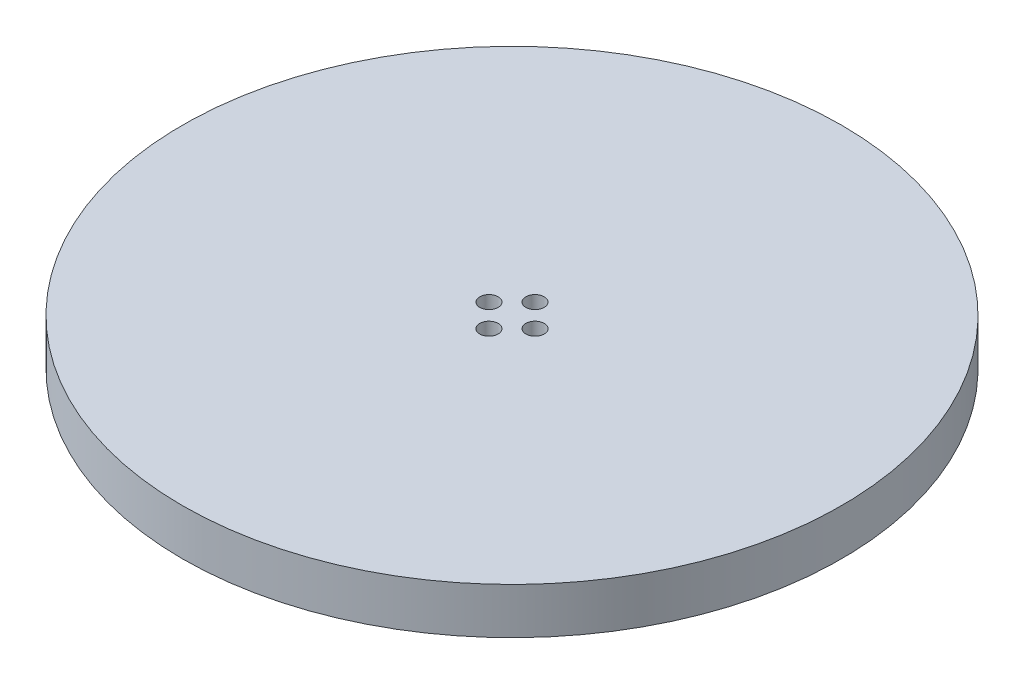
ISO-10303-21;
HEADER;
FILE_DESCRIPTION(('STEP AP214'),'2;1');
FILE_NAME('part.step','',(''),(''),'','','');
FILE_SCHEMA(('AUTOMOTIVE_DESIGN { 1 0 10303 214 1 1 1 1 }'));
ENDSEC;
DATA;
#1=APPLICATION_CONTEXT('core data for automotive mechanical design processes');
#2=APPLICATION_PROTOCOL_DEFINITION('international standard','automotive_design',2000,#1);
#3=PRODUCT_CONTEXT('',#1,'mechanical');
#4=PRODUCT('Part','Part','',(#3));
#5=PRODUCT_RELATED_PRODUCT_CATEGORY('part','',(#4));
#6=PRODUCT_DEFINITION_FORMATION('','',#4);
#7=PRODUCT_DEFINITION_CONTEXT('part definition',#1,'design');
#8=PRODUCT_DEFINITION('design','',#6,#7);
#9=PRODUCT_DEFINITION_SHAPE('','',#8);
#10=(LENGTH_UNIT() NAMED_UNIT(*) SI_UNIT(.MILLI.,.METRE.));
#11=(NAMED_UNIT(*) PLANE_ANGLE_UNIT() SI_UNIT($,.RADIAN.));
#12=(NAMED_UNIT(*) SI_UNIT($,.STERADIAN.) SOLID_ANGLE_UNIT());
#13=UNCERTAINTY_MEASURE_WITH_UNIT(LENGTH_MEASURE(1.E-05),#10,'distance_accuracy_value','');
#14=(GEOMETRIC_REPRESENTATION_CONTEXT(3) GLOBAL_UNCERTAINTY_ASSIGNED_CONTEXT((#13)) GLOBAL_UNIT_ASSIGNED_CONTEXT((#10,
#11,#12)) REPRESENTATION_CONTEXT('',''));
#15=CARTESIAN_POINT('',(0.,0.,0.));
#16=DIRECTION('',(0.,0.,1.));
#17=DIRECTION('',(1.,0.,0.));
#18=AXIS2_PLACEMENT_3D('',#15,#16,#17);
#19=CARTESIAN_POINT('',(-5.,10.,0.));
#20=DIRECTION('',(0.,-1.,0.));
#21=DIRECTION('',(0.,0.,-1.));
#22=AXIS2_PLACEMENT_3D('',#19,#20,#21);
#23=CYLINDRICAL_SURFACE('',#22,2.);
#24=CARTESIAN_POINT('',(-5.,10.,0.));
#25=DIRECTION('',(0.,1.,0.));
#26=DIRECTION('',(0.,0.,1.));
#27=AXIS2_PLACEMENT_3D('',#24,#25,#26);
#28=CIRCLE('',#27,2.);
#29=CARTESIAN_POINT('',(-5.,10.,2.));
#30=VERTEX_POINT('',#29);
#31=EDGE_CURVE('E41',#30,#30,#28,.T.);
#32=ORIENTED_EDGE('',*,*,#31,.T.);
#33=EDGE_LOOP('',(#32));
#34=FACE_BOUND('',#33,.T.);
#35=CARTESIAN_POINT('',(-5.,0.,0.));
#36=DIRECTION('',(0.,1.,0.));
#37=DIRECTION('',(0.,0.,1.));
#38=AXIS2_PLACEMENT_3D('',#35,#36,#37);
#39=CIRCLE('',#38,2.);
#40=CARTESIAN_POINT('',(-5.,0.,2.));
#41=VERTEX_POINT('',#40);
#42=EDGE_CURVE('E58',#41,#41,#39,.T.);
#43=ORIENTED_EDGE('',*,*,#42,.F.);
#44=EDGE_LOOP('',(#43));
#45=FACE_BOUND('',#44,.T.);
#46=ADVANCED_FACE('F33',(#34,#45),#23,.F.);
#47=CARTESIAN_POINT('',(0.,10.,0.));
#48=DIRECTION('',(0.,-1.,0.));
#49=DIRECTION('',(0.,0.,-1.));
#50=AXIS2_PLACEMENT_3D('',#47,#48,#49);
#51=CYLINDRICAL_SURFACE('',#50,71.5);
#52=CARTESIAN_POINT('',(0.,10.,0.));
#53=DIRECTION('',(0.,1.,0.));
#54=DIRECTION('',(0.,0.,1.));
#55=AXIS2_PLACEMENT_3D('',#52,#53,#54);
#56=CIRCLE('',#55,71.5);
#57=CARTESIAN_POINT('',(0.,10.,71.5));
#58=VERTEX_POINT('',#57);
#59=EDGE_CURVE('E46',#58,#58,#56,.T.);
#60=ORIENTED_EDGE('',*,*,#59,.F.);
#61=EDGE_LOOP('',(#60));
#62=FACE_BOUND('',#61,.T.);
#63=CARTESIAN_POINT('',(0.,0.,0.));
#64=DIRECTION('',(0.,1.,0.));
#65=DIRECTION('',(0.,0.,1.));
#66=AXIS2_PLACEMENT_3D('',#63,#64,#65);
#67=CIRCLE('',#66,71.5);
#68=CARTESIAN_POINT('',(0.,0.,71.5));
#69=VERTEX_POINT('',#68);
#70=EDGE_CURVE('E56',#69,#69,#67,.T.);
#71=ORIENTED_EDGE('',*,*,#70,.T.);
#72=EDGE_LOOP('',(#71));
#73=FACE_BOUND('',#72,.T.);
#74=ADVANCED_FACE('F79',(#62,#73),#51,.T.);
#75=CARTESIAN_POINT('',(0.,10.,5.));
#76=DIRECTION('',(0.,-1.,0.));
#77=DIRECTION('',(0.,0.,-1.));
#78=AXIS2_PLACEMENT_3D('',#75,#76,#77);
#79=CYLINDRICAL_SURFACE('',#78,2.);
#80=CARTESIAN_POINT('',(0.,10.,5.));
#81=DIRECTION('',(0.,1.,0.));
#82=DIRECTION('',(0.,0.,1.));
#83=AXIS2_PLACEMENT_3D('',#80,#81,#82);
#84=CIRCLE('',#83,2.);
#85=CARTESIAN_POINT('',(0.,10.,7.));
#86=VERTEX_POINT('',#85);
#87=EDGE_CURVE('E67',#86,#86,#84,.T.);
#88=ORIENTED_EDGE('',*,*,#87,.T.);
#89=EDGE_LOOP('',(#88));
#90=FACE_BOUND('',#89,.T.);
#91=CARTESIAN_POINT('',(0.,0.,5.));
#92=DIRECTION('',(0.,1.,0.));
#93=DIRECTION('',(0.,0.,1.));
#94=AXIS2_PLACEMENT_3D('',#91,#92,#93);
#95=CIRCLE('',#94,2.);
#96=CARTESIAN_POINT('',(0.,0.,7.));
#97=VERTEX_POINT('',#96);
#98=EDGE_CURVE('E53',#97,#97,#95,.T.);
#99=ORIENTED_EDGE('',*,*,#98,.F.);
#100=EDGE_LOOP('',(#99));
#101=FACE_BOUND('',#100,.T.);
#102=ADVANCED_FACE('F82',(#90,#101),#79,.F.);
#103=CARTESIAN_POINT('',(0.,10.,-5.));
#104=DIRECTION('',(0.,-1.,0.));
#105=DIRECTION('',(0.,0.,-1.));
#106=AXIS2_PLACEMENT_3D('',#103,#104,#105);
#107=CYLINDRICAL_SURFACE('',#106,2.);
#108=CARTESIAN_POINT('',(0.,10.,-5.));
#109=DIRECTION('',(0.,1.,0.));
#110=DIRECTION('',(0.,0.,1.));
#111=AXIS2_PLACEMENT_3D('',#108,#109,#110);
#112=CIRCLE('',#111,2.);
#113=CARTESIAN_POINT('',(0.,10.,-3.));
#114=VERTEX_POINT('',#113);
#115=EDGE_CURVE('E63',#114,#114,#112,.T.);
#116=ORIENTED_EDGE('',*,*,#115,.T.);
#117=EDGE_LOOP('',(#116));
#118=FACE_BOUND('',#117,.T.);
#119=CARTESIAN_POINT('',(0.,0.,-5.));
#120=DIRECTION('',(0.,1.,0.));
#121=DIRECTION('',(0.,0.,1.));
#122=AXIS2_PLACEMENT_3D('',#119,#120,#121);
#123=CIRCLE('',#122,2.);
#124=CARTESIAN_POINT('',(0.,0.,-3.));
#125=VERTEX_POINT('',#124);
#126=EDGE_CURVE('E50',#125,#125,#123,.T.);
#127=ORIENTED_EDGE('',*,*,#126,.F.);
#128=EDGE_LOOP('',(#127));
#129=FACE_BOUND('',#128,.T.);
#130=ADVANCED_FACE('F35',(#118,#129),#107,.F.);
#131=CARTESIAN_POINT('',(5.,10.,0.));
#132=DIRECTION('',(0.,-1.,0.));
#133=DIRECTION('',(0.,0.,-1.));
#134=AXIS2_PLACEMENT_3D('',#131,#132,#133);
#135=CYLINDRICAL_SURFACE('',#134,2.);
#136=CARTESIAN_POINT('',(5.,10.,0.));
#137=DIRECTION('',(0.,1.,0.));
#138=DIRECTION('',(0.,0.,1.));
#139=AXIS2_PLACEMENT_3D('',#136,#137,#138);
#140=CIRCLE('',#139,2.);
#141=CARTESIAN_POINT('',(5.,10.,2.));
#142=VERTEX_POINT('',#141);
#143=EDGE_CURVE('E10',#142,#142,#140,.F.);
#144=ORIENTED_EDGE('',*,*,#143,.F.);
#145=EDGE_LOOP('',(#144));
#146=FACE_BOUND('',#145,.T.);
#147=CARTESIAN_POINT('',(5.,0.,0.));
#148=DIRECTION('',(0.,1.,0.));
#149=DIRECTION('',(0.,0.,1.));
#150=AXIS2_PLACEMENT_3D('',#147,#148,#149);
#151=CIRCLE('',#150,2.);
#152=CARTESIAN_POINT('',(5.,0.,2.));
#153=VERTEX_POINT('',#152);
#154=EDGE_CURVE('E37',#153,#153,#151,.F.);
#155=ORIENTED_EDGE('',*,*,#154,.T.);
#156=EDGE_LOOP('',(#155));
#157=FACE_BOUND('',#156,.T.);
#158=ADVANCED_FACE('F94',(#146,#157),#135,.F.);
#159=CARTESIAN_POINT('',(0.,10.,0.));
#160=DIRECTION('',(0.,1.,0.));
#161=DIRECTION('',(0.,0.,1.));
#162=AXIS2_PLACEMENT_3D('',#159,#160,#161);
#163=PLANE('',#162);
#164=ORIENTED_EDGE('',*,*,#115,.F.);
#165=EDGE_LOOP('',(#164));
#166=FACE_BOUND('',#165,.T.);
#167=ORIENTED_EDGE('',*,*,#87,.F.);
#168=EDGE_LOOP('',(#167));
#169=FACE_BOUND('',#168,.T.);
#170=ORIENTED_EDGE('',*,*,#59,.T.);
#171=EDGE_LOOP('',(#170));
#172=FACE_BOUND('',#171,.T.);
#173=ORIENTED_EDGE('',*,*,#31,.F.);
#174=EDGE_LOOP('',(#173));
#175=FACE_BOUND('',#174,.T.);
#176=ORIENTED_EDGE('',*,*,#143,.T.);
#177=EDGE_LOOP('',(#176));
#178=FACE_BOUND('',#177,.T.);
#179=ADVANCED_FACE('F76',(#166,#169,#172,#175,#178),#163,.T.);
#180=CARTESIAN_POINT('',(0.,0.,0.));
#181=DIRECTION('',(0.,1.,0.));
#182=DIRECTION('',(0.,0.,1.));
#183=AXIS2_PLACEMENT_3D('',#180,#181,#182);
#184=PLANE('',#183);
#185=ORIENTED_EDGE('',*,*,#126,.T.);
#186=EDGE_LOOP('',(#185));
#187=FACE_BOUND('',#186,.T.);
#188=ORIENTED_EDGE('',*,*,#98,.T.);
#189=EDGE_LOOP('',(#188));
#190=FACE_BOUND('',#189,.T.);
#191=ORIENTED_EDGE('',*,*,#70,.F.);
#192=EDGE_LOOP('',(#191));
#193=FACE_BOUND('',#192,.T.);
#194=ORIENTED_EDGE('',*,*,#42,.T.);
#195=EDGE_LOOP('',(#194));
#196=FACE_BOUND('',#195,.T.);
#197=ORIENTED_EDGE('',*,*,#154,.F.);
#198=EDGE_LOOP('',(#197));
#199=FACE_BOUND('',#198,.T.);
#200=ADVANCED_FACE('F86',(#187,#190,#193,#196,#199),#184,.F.);
#201=CLOSED_SHELL('',(#46,#74,#102,#130,#158,#179,#200));
#202=MANIFOLD_SOLID_BREP('B2',#201);
#203=ADVANCED_BREP_SHAPE_REPRESENTATION('',(#18,#202),#14);
#204=SHAPE_DEFINITION_REPRESENTATION(#9,#203);
ENDSEC;
END-ISO-10303-21;
